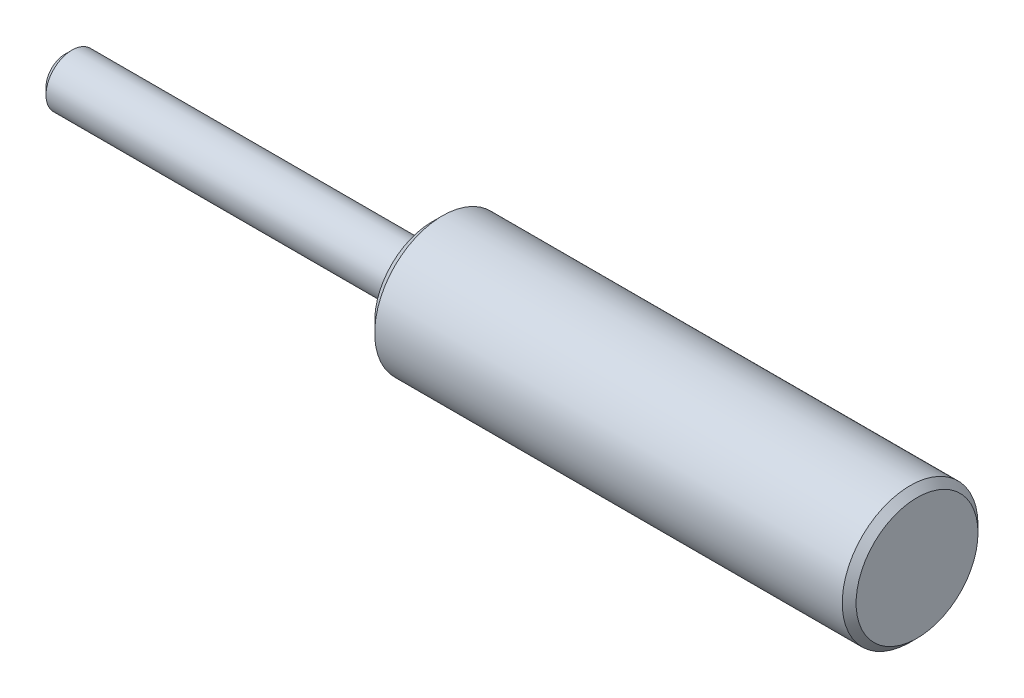
ISO-10303-21;
HEADER;
FILE_DESCRIPTION(('STEP AP214'),'2;1');
FILE_NAME('part.step','',(''),(''),'','','');
FILE_SCHEMA(('AUTOMOTIVE_DESIGN { 1 0 10303 214 1 1 1 1 }'));
ENDSEC;
DATA;
#1=APPLICATION_CONTEXT('core data for automotive mechanical design processes');
#2=APPLICATION_PROTOCOL_DEFINITION('international standard','automotive_design',2000,#1);
#3=PRODUCT_CONTEXT('',#1,'mechanical');
#4=PRODUCT('Part','Part','',(#3));
#5=PRODUCT_RELATED_PRODUCT_CATEGORY('part','',(#4));
#6=PRODUCT_DEFINITION_FORMATION('','',#4);
#7=PRODUCT_DEFINITION_CONTEXT('part definition',#1,'design');
#8=PRODUCT_DEFINITION('design','',#6,#7);
#9=PRODUCT_DEFINITION_SHAPE('','',#8);
#10=(LENGTH_UNIT() NAMED_UNIT(*) SI_UNIT(.MILLI.,.METRE.));
#11=(NAMED_UNIT(*) PLANE_ANGLE_UNIT() SI_UNIT($,.RADIAN.));
#12=(NAMED_UNIT(*) SI_UNIT($,.STERADIAN.) SOLID_ANGLE_UNIT());
#13=UNCERTAINTY_MEASURE_WITH_UNIT(LENGTH_MEASURE(1.E-05),#10,'distance_accuracy_value','');
#14=(GEOMETRIC_REPRESENTATION_CONTEXT(3) GLOBAL_UNCERTAINTY_ASSIGNED_CONTEXT((#13)) GLOBAL_UNIT_ASSIGNED_CONTEXT((#10,
#11,#12)) REPRESENTATION_CONTEXT('',''));
#15=CARTESIAN_POINT('',(0.,0.,0.));
#16=DIRECTION('',(0.,0.,1.));
#17=DIRECTION('',(1.,0.,0.));
#18=AXIS2_PLACEMENT_3D('',#15,#16,#17);
#19=CARTESIAN_POINT('',(70.,0.,0.));
#20=DIRECTION('',(-1.,0.,0.));
#21=DIRECTION('',(0.,0.,1.));
#22=AXIS2_PLACEMENT_3D('',#19,#20,#21);
#23=CYLINDRICAL_SURFACE('',#22,9.8);
#24=CARTESIAN_POINT('',(69.,0.,0.));
#25=DIRECTION('',(1.,0.,0.));
#26=DIRECTION('',(0.,0.,-1.));
#27=AXIS2_PLACEMENT_3D('',#24,#25,#26);
#28=CIRCLE('',#27,9.8);
#29=CARTESIAN_POINT('',(69.,0.,-9.8));
#30=VERTEX_POINT('',#29);
#31=EDGE_CURVE('E10',#30,#30,#28,.F.);
#32=ORIENTED_EDGE('',*,*,#31,.T.);
#33=EDGE_LOOP('',(#32));
#34=FACE_BOUND('',#33,.T.);
#35=CARTESIAN_POINT('',(1.5,0.,0.));
#36=DIRECTION('',(1.,0.,0.));
#37=DIRECTION('',(0.,0.,-1.));
#38=AXIS2_PLACEMENT_3D('',#35,#36,#37);
#39=CIRCLE('',#38,9.8);
#40=CARTESIAN_POINT('',(1.5,0.,-9.8));
#41=VERTEX_POINT('',#40);
#42=EDGE_CURVE('E59',#41,#41,#39,.T.);
#43=ORIENTED_EDGE('',*,*,#42,.T.);
#44=EDGE_LOOP('',(#43));
#45=FACE_BOUND('',#44,.T.);
#46=ADVANCED_FACE('F35',(#34,#45),#23,.T.);
#47=CARTESIAN_POINT('',(70.,0.,0.));
#48=DIRECTION('',(1.,0.,0.));
#49=DIRECTION('',(0.,0.,-1.));
#50=AXIS2_PLACEMENT_3D('',#47,#48,#49);
#51=PLANE('',#50);
#52=CARTESIAN_POINT('',(70.,0.,0.));
#53=DIRECTION('',(1.,0.,0.));
#54=DIRECTION('',(0.,0.,-1.));
#55=AXIS2_PLACEMENT_3D('',#52,#53,#54);
#56=CIRCLE('',#55,8.80000000000003);
#57=CARTESIAN_POINT('',(70.,0.,-8.80000000000003));
#58=VERTEX_POINT('',#57);
#59=EDGE_CURVE('E43',#58,#58,#56,.T.);
#60=ORIENTED_EDGE('',*,*,#59,.T.);
#61=EDGE_LOOP('',(#60));
#62=FACE_BOUND('',#61,.T.);
#63=ADVANCED_FACE('F70',(#62),#51,.T.);
#64=CARTESIAN_POINT('',(0.,0.,0.));
#65=DIRECTION('',(1.,0.,0.));
#66=DIRECTION('',(0.,0.,-1.));
#67=AXIS2_PLACEMENT_3D('',#64,#65,#66);
#68=PLANE('',#67);
#69=CARTESIAN_POINT('',(0.,0.,0.));
#70=DIRECTION('',(1.,0.,0.));
#71=DIRECTION('',(0.,0.,-1.));
#72=AXIS2_PLACEMENT_3D('',#69,#70,#71);
#73=CIRCLE('',#72,8.3);
#74=CARTESIAN_POINT('',(0.,0.,-8.3));
#75=VERTEX_POINT('',#74);
#76=EDGE_CURVE('E56',#75,#75,#73,.F.);
#77=ORIENTED_EDGE('',*,*,#76,.T.);
#78=EDGE_LOOP('',(#77));
#79=FACE_BOUND('',#78,.T.);
#80=CARTESIAN_POINT('',(0.,0.,0.));
#81=DIRECTION('',(-1.,0.,0.));
#82=DIRECTION('',(0.,0.,1.));
#83=AXIS2_PLACEMENT_3D('',#80,#81,#82);
#84=CIRCLE('',#83,3.75);
#85=CARTESIAN_POINT('',(0.,0.,3.75));
#86=VERTEX_POINT('',#85);
#87=EDGE_CURVE('E62',#86,#86,#84,.T.);
#88=ORIENTED_EDGE('',*,*,#87,.F.);
#89=EDGE_LOOP('',(#88));
#90=FACE_BOUND('',#89,.T.);
#91=ADVANCED_FACE('F68',(#79,#90),#68,.F.);
#92=CARTESIAN_POINT('',(-53.,0.,0.));
#93=DIRECTION('',(1.,0.,0.));
#94=DIRECTION('',(0.,0.,-1.));
#95=AXIS2_PLACEMENT_3D('',#92,#93,#94);
#96=CYLINDRICAL_SURFACE('',#95,3.75);
#97=CARTESIAN_POINT('',(-52.,0.,0.));
#98=DIRECTION('',(-1.,0.,0.));
#99=DIRECTION('',(0.,0.,1.));
#100=AXIS2_PLACEMENT_3D('',#97,#98,#99);
#101=CIRCLE('',#100,3.75);
#102=CARTESIAN_POINT('',(-52.,0.,3.75));
#103=VERTEX_POINT('',#102);
#104=EDGE_CURVE('E47',#103,#103,#101,.F.);
#105=ORIENTED_EDGE('',*,*,#104,.T.);
#106=EDGE_LOOP('',(#105));
#107=FACE_BOUND('',#106,.T.);
#108=ORIENTED_EDGE('',*,*,#87,.T.);
#109=EDGE_LOOP('',(#108));
#110=FACE_BOUND('',#109,.T.);
#111=ADVANCED_FACE('F66',(#107,#110),#96,.T.);
#112=CARTESIAN_POINT('',(-53.,0.,0.));
#113=DIRECTION('',(-1.,0.,0.));
#114=DIRECTION('',(0.,0.,1.));
#115=AXIS2_PLACEMENT_3D('',#112,#113,#114);
#116=PLANE('',#115);
#117=CARTESIAN_POINT('',(-53.,0.,0.));
#118=DIRECTION('',(-1.,0.,0.));
#119=DIRECTION('',(0.,0.,1.));
#120=AXIS2_PLACEMENT_3D('',#117,#118,#119);
#121=CIRCLE('',#120,2.75);
#122=CARTESIAN_POINT('',(-53.,0.,2.75));
#123=VERTEX_POINT('',#122);
#124=EDGE_CURVE('E51',#123,#123,#121,.T.);
#125=ORIENTED_EDGE('',*,*,#124,.T.);
#126=EDGE_LOOP('',(#125));
#127=FACE_BOUND('',#126,.T.);
#128=ADVANCED_FACE('F77',(#127),#116,.T.);
#129=CARTESIAN_POINT('',(1.5,0.,0.));
#130=DIRECTION('',(1.,0.,0.));
#131=DIRECTION('',(0.,0.,-1.));
#132=AXIS2_PLACEMENT_3D('',#129,#130,#131);
#133=CONICAL_SURFACE('',#132,9.8,0.785398163397448);
#134=ORIENTED_EDGE('',*,*,#76,.F.);
#135=EDGE_LOOP('',(#134));
#136=FACE_BOUND('',#135,.T.);
#137=ORIENTED_EDGE('',*,*,#42,.F.);
#138=EDGE_LOOP('',(#137));
#139=FACE_BOUND('',#138,.T.);
#140=ADVANCED_FACE('F88',(#136,#139),#133,.T.);
#141=CARTESIAN_POINT('',(-53.,0.,0.));
#142=DIRECTION('',(1.,0.,0.));
#143=DIRECTION('',(0.,0.,-1.));
#144=AXIS2_PLACEMENT_3D('',#141,#142,#143);
#145=CONICAL_SURFACE('',#144,2.75,0.785398163397443);
#146=ORIENTED_EDGE('',*,*,#104,.F.);
#147=EDGE_LOOP('',(#146));
#148=FACE_BOUND('',#147,.T.);
#149=ORIENTED_EDGE('',*,*,#124,.F.);
#150=EDGE_LOOP('',(#149));
#151=FACE_BOUND('',#150,.T.);
#152=ADVANCED_FACE('F93',(#148,#151),#145,.T.);
#153=CARTESIAN_POINT('',(70.,0.,0.));
#154=DIRECTION('',(-1.,0.,0.));
#155=DIRECTION('',(0.,0.,1.));
#156=AXIS2_PLACEMENT_3D('',#153,#154,#155);
#157=CONICAL_SURFACE('',#156,8.80000000000003,0.785398163397435);
#158=ORIENTED_EDGE('',*,*,#31,.F.);
#159=EDGE_LOOP('',(#158));
#160=FACE_BOUND('',#159,.T.);
#161=ORIENTED_EDGE('',*,*,#59,.F.);
#162=EDGE_LOOP('',(#161));
#163=FACE_BOUND('',#162,.T.);
#164=ADVANCED_FACE('F38',(#160,#163),#157,.T.);
#165=CLOSED_SHELL('',(#46,#63,#91,#111,#128,#140,#152,#164));
#166=MANIFOLD_SOLID_BREP('B2',#165);
#167=ADVANCED_BREP_SHAPE_REPRESENTATION('',(#18,#166),#14);
#168=SHAPE_DEFINITION_REPRESENTATION(#9,#167);
ENDSEC;
END-ISO-10303-21;
